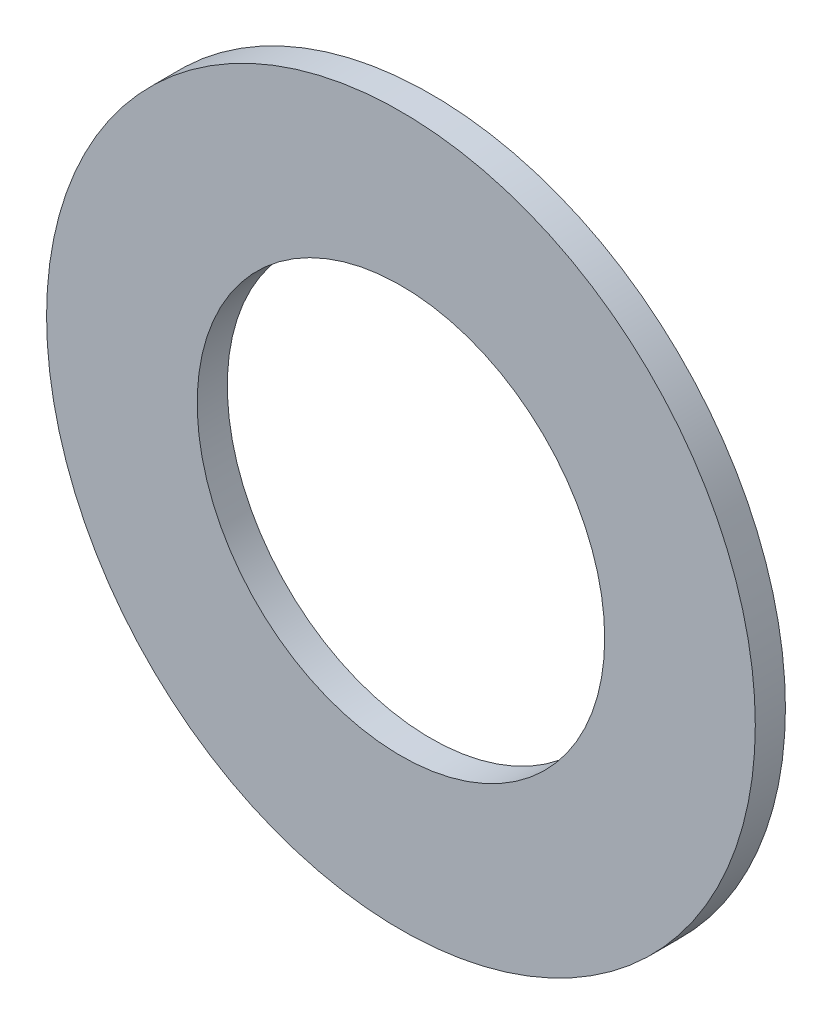
ISO-10303-21;
HEADER;
FILE_DESCRIPTION(('STEP AP214'),'2;1');
FILE_NAME('part.step','',(''),(''),'','','');
FILE_SCHEMA(('AUTOMOTIVE_DESIGN { 1 0 10303 214 1 1 1 1 }'));
ENDSEC;
DATA;
#1=APPLICATION_CONTEXT('core data for automotive mechanical design processes');
#2=APPLICATION_PROTOCOL_DEFINITION('international standard','automotive_design',2000,#1);
#3=PRODUCT_CONTEXT('',#1,'mechanical');
#4=PRODUCT('Part','Part','',(#3));
#5=PRODUCT_RELATED_PRODUCT_CATEGORY('part','',(#4));
#6=PRODUCT_DEFINITION_FORMATION('','',#4);
#7=PRODUCT_DEFINITION_CONTEXT('part definition',#1,'design');
#8=PRODUCT_DEFINITION('design','',#6,#7);
#9=PRODUCT_DEFINITION_SHAPE('','',#8);
#10=(LENGTH_UNIT() NAMED_UNIT(*) SI_UNIT(.MILLI.,.METRE.));
#11=(NAMED_UNIT(*) PLANE_ANGLE_UNIT() SI_UNIT($,.RADIAN.));
#12=(NAMED_UNIT(*) SI_UNIT($,.STERADIAN.) SOLID_ANGLE_UNIT());
#13=UNCERTAINTY_MEASURE_WITH_UNIT(LENGTH_MEASURE(1.E-05),#10,'distance_accuracy_value','');
#14=(GEOMETRIC_REPRESENTATION_CONTEXT(3) GLOBAL_UNCERTAINTY_ASSIGNED_CONTEXT((#13)) GLOBAL_UNIT_ASSIGNED_CONTEXT((#10,
#11,#12)) REPRESENTATION_CONTEXT('',''));
#15=CARTESIAN_POINT('',(0.,0.,0.));
#16=DIRECTION('',(0.,0.,1.));
#17=DIRECTION('',(1.,0.,0.));
#18=AXIS2_PLACEMENT_3D('',#15,#16,#17);
#19=CARTESIAN_POINT('',(0.,0.,1.7));
#20=DIRECTION('',(0.,0.,1.));
#21=DIRECTION('',(1.,0.,0.));
#22=AXIS2_PLACEMENT_3D('',#19,#20,#21);
#23=PLANE('',#22);
#24=CARTESIAN_POINT('',(0.,0.,1.7));
#25=DIRECTION('',(0.,0.,1.));
#26=DIRECTION('',(1.,0.,0.));
#27=AXIS2_PLACEMENT_3D('',#24,#25,#26);
#28=CIRCLE('',#27,20.);
#29=CARTESIAN_POINT('',(20.,0.,1.7));
#30=VERTEX_POINT('',#29);
#31=EDGE_CURVE('E10',#30,#30,#28,.T.);
#32=ORIENTED_EDGE('',*,*,#31,.T.);
#33=EDGE_LOOP('',(#32));
#34=FACE_BOUND('',#33,.T.);
#35=CARTESIAN_POINT('',(0.,0.,1.7));
#36=DIRECTION('',(0.,0.,1.));
#37=DIRECTION('',(1.,0.,0.));
#38=AXIS2_PLACEMENT_3D('',#35,#36,#37);
#39=CIRCLE('',#38,11.5);
#40=CARTESIAN_POINT('',(11.5,0.,1.7));
#41=VERTEX_POINT('',#40);
#42=EDGE_CURVE('E42',#41,#41,#39,.T.);
#43=ORIENTED_EDGE('',*,*,#42,.F.);
#44=EDGE_LOOP('',(#43));
#45=FACE_BOUND('',#44,.T.);
#46=ADVANCED_FACE('F31',(#34,#45),#23,.T.);
#47=CARTESIAN_POINT('',(0.,0.,0.));
#48=DIRECTION('',(0.,0.,1.));
#49=DIRECTION('',(1.,0.,0.));
#50=AXIS2_PLACEMENT_3D('',#47,#48,#49);
#51=PLANE('',#50);
#52=CARTESIAN_POINT('',(0.,0.,0.));
#53=DIRECTION('',(0.,0.,1.));
#54=DIRECTION('',(1.,0.,0.));
#55=AXIS2_PLACEMENT_3D('',#52,#53,#54);
#56=CIRCLE('',#55,20.);
#57=CARTESIAN_POINT('',(20.,0.,0.));
#58=VERTEX_POINT('',#57);
#59=EDGE_CURVE('E35',#58,#58,#56,.T.);
#60=ORIENTED_EDGE('',*,*,#59,.F.);
#61=EDGE_LOOP('',(#60));
#62=FACE_BOUND('',#61,.T.);
#63=CARTESIAN_POINT('',(0.,0.,0.));
#64=DIRECTION('',(0.,0.,1.));
#65=DIRECTION('',(1.,0.,0.));
#66=AXIS2_PLACEMENT_3D('',#63,#64,#65);
#67=CIRCLE('',#66,11.5);
#68=CARTESIAN_POINT('',(11.5,0.,0.));
#69=VERTEX_POINT('',#68);
#70=EDGE_CURVE('E44',#69,#69,#67,.T.);
#71=ORIENTED_EDGE('',*,*,#70,.T.);
#72=EDGE_LOOP('',(#71));
#73=FACE_BOUND('',#72,.T.);
#74=ADVANCED_FACE('F54',(#62,#73),#51,.F.);
#75=CARTESIAN_POINT('',(0.,0.,1.7));
#76=DIRECTION('',(0.,0.,-1.));
#77=DIRECTION('',(-1.,0.,0.));
#78=AXIS2_PLACEMENT_3D('',#75,#76,#77);
#79=CYLINDRICAL_SURFACE('',#78,20.);
#80=ORIENTED_EDGE('',*,*,#31,.F.);
#81=EDGE_LOOP('',(#80));
#82=FACE_BOUND('',#81,.T.);
#83=ORIENTED_EDGE('',*,*,#59,.T.);
#84=EDGE_LOOP('',(#83));
#85=FACE_BOUND('',#84,.T.);
#86=ADVANCED_FACE('F33',(#82,#85),#79,.T.);
#87=CARTESIAN_POINT('',(0.,0.,1.7));
#88=DIRECTION('',(0.,0.,-1.));
#89=DIRECTION('',(-1.,0.,0.));
#90=AXIS2_PLACEMENT_3D('',#87,#88,#89);
#91=CYLINDRICAL_SURFACE('',#90,11.5);
#92=ORIENTED_EDGE('',*,*,#42,.T.);
#93=EDGE_LOOP('',(#92));
#94=FACE_BOUND('',#93,.T.);
#95=ORIENTED_EDGE('',*,*,#70,.F.);
#96=EDGE_LOOP('',(#95));
#97=FACE_BOUND('',#96,.T.);
#98=ADVANCED_FACE('F50',(#94,#97),#91,.F.);
#99=CLOSED_SHELL('',(#46,#74,#86,#98));
#100=MANIFOLD_SOLID_BREP('B2',#99);
#101=ADVANCED_BREP_SHAPE_REPRESENTATION('',(#18,#100),#14);
#102=SHAPE_DEFINITION_REPRESENTATION(#9,#101);
ENDSEC;
END-ISO-10303-21;
